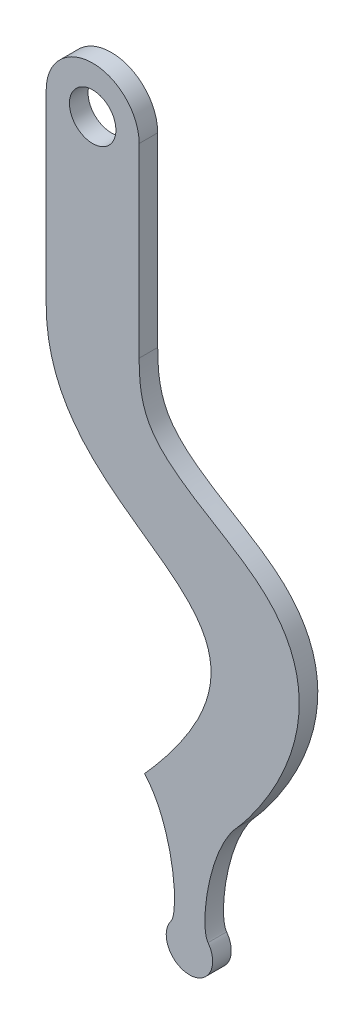
ISO-10303-21;
HEADER;
FILE_DESCRIPTION(('STEP AP214'),'2;1');
FILE_NAME('part.step','',(''),(''),'','','');
FILE_SCHEMA(('AUTOMOTIVE_DESIGN { 1 0 10303 214 1 1 1 1 }'));
ENDSEC;
DATA;
#1=APPLICATION_CONTEXT('core data for automotive mechanical design processes');
#2=APPLICATION_PROTOCOL_DEFINITION('international standard','automotive_design',2000,#1);
#3=PRODUCT_CONTEXT('',#1,'mechanical');
#4=PRODUCT('Part','Part','',(#3));
#5=PRODUCT_RELATED_PRODUCT_CATEGORY('part','',(#4));
#6=PRODUCT_DEFINITION_FORMATION('','',#4);
#7=PRODUCT_DEFINITION_CONTEXT('part definition',#1,'design');
#8=PRODUCT_DEFINITION('design','',#6,#7);
#9=PRODUCT_DEFINITION_SHAPE('','',#8);
#10=(LENGTH_UNIT() NAMED_UNIT(*) SI_UNIT(.MILLI.,.METRE.));
#11=(NAMED_UNIT(*) PLANE_ANGLE_UNIT() SI_UNIT($,.RADIAN.));
#12=(NAMED_UNIT(*) SI_UNIT($,.STERADIAN.) SOLID_ANGLE_UNIT());
#13=UNCERTAINTY_MEASURE_WITH_UNIT(LENGTH_MEASURE(1.E-05),#10,'distance_accuracy_value','');
#14=(GEOMETRIC_REPRESENTATION_CONTEXT(3) GLOBAL_UNCERTAINTY_ASSIGNED_CONTEXT((#13)) GLOBAL_UNIT_ASSIGNED_CONTEXT((#10,
#11,#12)) REPRESENTATION_CONTEXT('',''));
#15=CARTESIAN_POINT('',(0.,0.,0.));
#16=DIRECTION('',(0.,0.,1.));
#17=DIRECTION('',(1.,0.,0.));
#18=AXIS2_PLACEMENT_3D('',#15,#16,#17);
#19=CARTESIAN_POINT('',(0.696388497802958,-4.20667264142367,0.2));
#20=DIRECTION('',(0.,0.,-1.));
#21=DIRECTION('',(-1.,0.,0.));
#22=AXIS2_PLACEMENT_3D('',#19,#20,#21);
#23=PLANE('',#22);
#24=CARTESIAN_POINT('',(0.105412554621511,-6.10048055354415,0.199999999999999));
#25=CARTESIAN_POINT('',(0.148079668611347,-6.05492728087401,0.199999999999999));
#26=CARTESIAN_POINT('',(1.61155707372034,-4.39334483472324,0.2));
#27=CARTESIAN_POINT('',(-0.792723593902476,-3.03979449257337,0.2));
#28=CARTESIAN_POINT('',(-0.95304954466865,-2.7775961525932,0.2));
#29=CARTESIAN_POINT('',(-0.95304954466865,-2.25804121810582,0.2));
#30=B_SPLINE_CURVE_WITH_KNOTS('',3,(#24,#25,#26,#27,#28,#29),.UNSPECIFIED.,.F.,.F.,(4,1,1,4),
(0.,0.597240631349052,0.697240631349052,1.),.UNSPECIFIED.);
#31=CARTESIAN_POINT('',(0.105412554621511,-6.10048055354415,0.199999999999999));
#32=VERTEX_POINT('',#31);
#33=CARTESIAN_POINT('',(-0.95304954466865,-2.25804121810582,0.2));
#34=VERTEX_POINT('',#33);
#35=EDGE_CURVE('E174',#32,#34,#30,.T.);
#36=ORIENTED_EDGE('',*,*,#35,.T.);
#37=DIRECTION('',(0.,1.,0.));
#38=VECTOR('',#37,1.);
#39=CARTESIAN_POINT('',(-0.953049544668638,-0.258041218105816,0.199999999999999));
#40=LINE('',#39,#38);
#41=CARTESIAN_POINT('',(-0.953049544668638,-0.258041218105816,0.199999999999999));
#42=VERTEX_POINT('',#41);
#43=EDGE_CURVE('E95',#34,#42,#40,.T.);
#44=ORIENTED_EDGE('',*,*,#43,.T.);
#45=CARTESIAN_POINT('',(-1.45304954466864,-0.25804121810582,0.2));
#46=DIRECTION('',(0.,0.,1.));
#47=DIRECTION('',(1.,0.,0.));
#48=AXIS2_PLACEMENT_3D('',#45,#46,#47);
#49=CIRCLE('',#48,0.5);
#50=CARTESIAN_POINT('',(-1.95304954466864,-0.258041218105816,0.2));
#51=VERTEX_POINT('',#50);
#52=EDGE_CURVE('E172',#42,#51,#49,.T.);
#53=ORIENTED_EDGE('',*,*,#52,.T.);
#54=DIRECTION('',(0.,-1.,0.));
#55=VECTOR('',#54,1.);
#56=CARTESIAN_POINT('',(-1.95304954466864,-0.258041218105816,0.2));
#57=LINE('',#56,#55);
#58=CARTESIAN_POINT('',(-1.95304954466864,-2.25804121810582,0.2));
#59=VERTEX_POINT('',#58);
#60=EDGE_CURVE('E167',#51,#59,#57,.T.);
#61=ORIENTED_EDGE('',*,*,#60,.T.);
#62=CARTESIAN_POINT('',(-1.95304954466864,-2.25804121810582,0.2));
#63=CARTESIAN_POINT('',(-1.95304954466864,-4.32449796511163,0.199999999999999));
#64=CARTESIAN_POINT('',(1.19310973735531,-3.74201596097796,0.199999999999999));
#65=CARTESIAN_POINT('',(-0.894587445378502,-6.10048055354416,0.2));
#66=B_SPLINE_CURVE_WITH_KNOTS('',3,(#62,#63,#64,#65),.UNSPECIFIED.,.F.,.F.,(4,4),(0.,1.),.UNSPECIFIED.);
#67=CARTESIAN_POINT('',(-0.894587445378502,-6.10048055354416,0.2));
#68=VERTEX_POINT('',#67);
#69=EDGE_CURVE('E114',#59,#68,#66,.T.);
#70=ORIENTED_EDGE('',*,*,#69,.T.);
#71=CARTESIAN_POINT('',(-0.89458744537849,-6.10048055354415,0.2));
#72=CARTESIAN_POINT('',(-0.584931114540511,-6.43434475882679,0.2));
#73=CARTESIAN_POINT('',(-0.516679069850095,-7.20728168186501,0.2));
#74=CARTESIAN_POINT('',(-0.61167974459731,-7.33394924819462,0.199999999999999));
#75=B_SPLINE_CURVE_WITH_KNOTS('',3,(#71,#72,#73,#74),.UNSPECIFIED.,.F.,.F.,(4,4),(0.,1.),.UNSPECIFIED.);
#76=CARTESIAN_POINT('',(-0.61167974459731,-7.33394924819462,0.199999999999999));
#77=VERTEX_POINT('',#76);
#78=EDGE_CURVE('E108',#68,#77,#75,.T.);
#79=ORIENTED_EDGE('',*,*,#78,.T.);
#80=CARTESIAN_POINT('',(-0.411679744597299,-7.48394924819463,0.2));
#81=DIRECTION('',(0.,0.,1.));
#82=DIRECTION('',(1.,0.,0.));
#83=AXIS2_PLACEMENT_3D('',#80,#81,#82);
#84=CIRCLE('',#83,0.25);
#85=CARTESIAN_POINT('',(-0.21167974459731,-7.33394924819463,0.2));
#86=VERTEX_POINT('',#85);
#87=EDGE_CURVE('E112',#77,#86,#84,.T.);
#88=ORIENTED_EDGE('',*,*,#87,.T.);
#89=CARTESIAN_POINT('',(-0.21167974459731,-7.33394924819463,0.2));
#90=CARTESIAN_POINT('',(-0.302912234997973,-7.21230592766041,0.2));
#91=CARTESIAN_POINT('',(-0.211828565051513,-6.43918101568676,0.2));
#92=CARTESIAN_POINT('',(0.105412554621511,-6.10048055354415,0.199999999999999));
#93=B_SPLINE_CURVE_WITH_KNOTS('',3,(#89,#90,#91,#92),.UNSPECIFIED.,.F.,.F.,(4,4),(0.,1.),.UNSPECIFIED.);
#94=EDGE_CURVE('E52',#86,#32,#93,.T.);
#95=ORIENTED_EDGE('',*,*,#94,.T.);
#96=EDGE_LOOP('',(#36,#44,#53,#61,#70,#79,#88,#95));
#97=FACE_BOUND('',#96,.T.);
#98=CARTESIAN_POINT('',(-1.45304954466864,-0.25804121810582,0.2));
#99=DIRECTION('',(0.,0.,1.));
#100=DIRECTION('',(1.,0.,0.));
#101=AXIS2_PLACEMENT_3D('',#98,#99,#100);
#102=CIRCLE('',#101,0.25);
#103=CARTESIAN_POINT('',(-1.20304954466864,-0.25804121810582,0.2));
#104=VERTEX_POINT('',#103);
#105=EDGE_CURVE('E185',#104,#104,#102,.T.);
#106=ORIENTED_EDGE('',*,*,#105,.F.);
#107=EDGE_LOOP('',(#106));
#108=FACE_BOUND('',#107,.T.);
#109=ADVANCED_FACE('F34',(#97,#108),#23,.F.);
#110=CARTESIAN_POINT('',(0.696388497802958,-4.20667264142367,0.));
#111=DIRECTION('',(0.,0.,-1.));
#112=DIRECTION('',(-1.,0.,0.));
#113=AXIS2_PLACEMENT_3D('',#110,#111,#112);
#114=PLANE('',#113);
#115=CARTESIAN_POINT('',(0.105412554621511,-6.10048055354415,0.));
#116=CARTESIAN_POINT('',(0.148079668611347,-6.054927280874,0.));
#117=CARTESIAN_POINT('',(1.61155707372034,-4.39334483472324,0.));
#118=CARTESIAN_POINT('',(-0.792723593902476,-3.03979449257337,0.));
#119=CARTESIAN_POINT('',(-0.95304954466865,-2.7775961525932,0.));
#120=CARTESIAN_POINT('',(-0.95304954466865,-2.25804121810582,0.));
#121=B_SPLINE_CURVE_WITH_KNOTS('',3,(#115,#116,#117,#118,#119,#120),.UNSPECIFIED.,.F.,.F.,(4,1,
1,4),(0.,0.597240631349052,0.697240631349052,1.),.UNSPECIFIED.);
#122=CARTESIAN_POINT('',(0.105412554621511,-6.10048055354414,0.));
#123=VERTEX_POINT('',#122);
#124=CARTESIAN_POINT('',(-0.95304954466865,-2.25804121810582,0.));
#125=VERTEX_POINT('',#124);
#126=EDGE_CURVE('E138',#123,#125,#121,.T.);
#127=ORIENTED_EDGE('',*,*,#126,.F.);
#128=CARTESIAN_POINT('',(-0.21167974459731,-7.33394924819462,0.));
#129=CARTESIAN_POINT('',(-0.302912234997973,-7.21230592766041,0.));
#130=CARTESIAN_POINT('',(-0.211828565051513,-6.43918101568676,0.));
#131=CARTESIAN_POINT('',(0.105412554621511,-6.10048055354414,0.));
#132=B_SPLINE_CURVE_WITH_KNOTS('',3,(#128,#129,#130,#131),.UNSPECIFIED.,.F.,.F.,(4,4),(0.,1.),.UNSPECIFIED.);
#133=CARTESIAN_POINT('',(-0.21167974459731,-7.33394924819462,0.));
#134=VERTEX_POINT('',#133);
#135=EDGE_CURVE('E87',#134,#123,#132,.T.);
#136=ORIENTED_EDGE('',*,*,#135,.F.);
#137=CARTESIAN_POINT('',(-0.411679744597299,-7.48394924819463,0.));
#138=DIRECTION('',(0.,0.,1.));
#139=DIRECTION('',(1.,0.,0.));
#140=AXIS2_PLACEMENT_3D('',#137,#138,#139);
#141=CIRCLE('',#140,0.25);
#142=CARTESIAN_POINT('',(-0.61167974459731,-7.33394924819462,0.));
#143=VERTEX_POINT('',#142);
#144=EDGE_CURVE('E81',#143,#134,#141,.T.);
#145=ORIENTED_EDGE('',*,*,#144,.F.);
#146=CARTESIAN_POINT('',(-0.89458744537849,-6.10048055354415,0.));
#147=CARTESIAN_POINT('',(-0.584931114540511,-6.43434475882679,0.));
#148=CARTESIAN_POINT('',(-0.516679069850095,-7.207281681865,0.));
#149=CARTESIAN_POINT('',(-0.61167974459731,-7.33394924819462,0.));
#150=B_SPLINE_CURVE_WITH_KNOTS('',3,(#146,#147,#148,#149),.UNSPECIFIED.,.F.,.F.,(4,4),(0.,1.),.UNSPECIFIED.);
#151=CARTESIAN_POINT('',(-0.894587445378502,-6.10048055354416,0.));
#152=VERTEX_POINT('',#151);
#153=EDGE_CURVE('E122',#152,#143,#150,.T.);
#154=ORIENTED_EDGE('',*,*,#153,.F.);
#155=CARTESIAN_POINT('',(-1.95304954466864,-2.25804121810582,0.));
#156=CARTESIAN_POINT('',(-1.95304954466864,-4.32449796511163,0.));
#157=CARTESIAN_POINT('',(1.19310973735531,-3.74201596097796,0.));
#158=CARTESIAN_POINT('',(-0.894587445378502,-6.10048055354416,0.));
#159=B_SPLINE_CURVE_WITH_KNOTS('',3,(#155,#156,#157,#158),.UNSPECIFIED.,.F.,.F.,(4,4),(0.,1.),.UNSPECIFIED.);
#160=CARTESIAN_POINT('',(-1.95304954466864,-2.25804121810582,0.));
#161=VERTEX_POINT('',#160);
#162=EDGE_CURVE('E200',#161,#152,#159,.T.);
#163=ORIENTED_EDGE('',*,*,#162,.F.);
#164=DIRECTION('',(0.,-1.,0.));
#165=VECTOR('',#164,1.);
#166=CARTESIAN_POINT('',(-1.95304954466864,-0.258041218105816,0.));
#167=LINE('',#166,#165);
#168=CARTESIAN_POINT('',(-1.95304954466864,-0.258041218105816,0.));
#169=VERTEX_POINT('',#168);
#170=EDGE_CURVE('E196',#169,#161,#167,.T.);
#171=ORIENTED_EDGE('',*,*,#170,.F.);
#172=CARTESIAN_POINT('',(-1.45304954466864,-0.25804121810582,0.));
#173=DIRECTION('',(0.,0.,1.));
#174=DIRECTION('',(1.,0.,0.));
#175=AXIS2_PLACEMENT_3D('',#172,#173,#174);
#176=CIRCLE('',#175,0.5);
#177=CARTESIAN_POINT('',(-0.953049544668638,-0.258041218105816,0.));
#178=VERTEX_POINT('',#177);
#179=EDGE_CURVE('E194',#178,#169,#176,.T.);
#180=ORIENTED_EDGE('',*,*,#179,.F.);
#181=DIRECTION('',(0.,1.,0.));
#182=VECTOR('',#181,1.);
#183=CARTESIAN_POINT('',(-0.953049544668638,-0.258041218105816,0.));
#184=LINE('',#183,#182);
#185=EDGE_CURVE('E190',#125,#178,#184,.T.);
#186=ORIENTED_EDGE('',*,*,#185,.F.);
#187=EDGE_LOOP('',(#127,#136,#145,#154,#163,#171,#180,#186));
#188=FACE_BOUND('',#187,.T.);
#189=CARTESIAN_POINT('',(-1.45304954466864,-0.25804121810582,0.));
#190=DIRECTION('',(0.,0.,1.));
#191=DIRECTION('',(1.,0.,0.));
#192=AXIS2_PLACEMENT_3D('',#189,#190,#191);
#193=CIRCLE('',#192,0.25);
#194=CARTESIAN_POINT('',(-1.20304954466864,-0.25804121810582,0.));
#195=VERTEX_POINT('',#194);
#196=EDGE_CURVE('E179',#195,#195,#193,.T.);
#197=ORIENTED_EDGE('',*,*,#196,.T.);
#198=EDGE_LOOP('',(#197));
#199=FACE_BOUND('',#198,.T.);
#200=ADVANCED_FACE('F151',(#188,#199),#114,.T.);
#201=DIRECTION('',(0.,0.,-1.));
#202=VECTOR('',#201,1.);
#203=SURFACE_OF_LINEAR_EXTRUSION('',#30,#202);
#204=ORIENTED_EDGE('',*,*,#126,.T.);
#205=DIRECTION('',(0.,0.,-1.));
#206=VECTOR('',#205,1.);
#207=CARTESIAN_POINT('',(-0.95304954466865,-2.25804121810582,0.2));
#208=LINE('',#207,#206);
#209=EDGE_CURVE('E11',#34,#125,#208,.T.);
#210=ORIENTED_EDGE('',*,*,#209,.F.);
#211=ORIENTED_EDGE('',*,*,#35,.F.);
#212=DIRECTION('',(0.,0.,-1.));
#213=VECTOR('',#212,1.);
#214=CARTESIAN_POINT('',(0.105412554621511,-6.10048055354415,0.199999999999999));
#215=LINE('',#214,#213);
#216=EDGE_CURVE('E128',#32,#123,#215,.T.);
#217=ORIENTED_EDGE('',*,*,#216,.T.);
#218=EDGE_LOOP('',(#204,#210,#211,#217));
#219=FACE_BOUND('',#218,.T.);
#220=ADVANCED_FACE('F36',(#219),#203,.F.);
#221=CARTESIAN_POINT('',(-0.953049544668638,-0.258041218105816,0.199999999999999));
#222=DIRECTION('',(-1.,0.,0.));
#223=DIRECTION('',(0.,-1.,0.));
#224=AXIS2_PLACEMENT_3D('',#221,#222,#223);
#225=PLANE('',#224);
#226=ORIENTED_EDGE('',*,*,#185,.T.);
#227=DIRECTION('',(0.,0.,-1.));
#228=VECTOR('',#227,1.);
#229=CARTESIAN_POINT('',(-0.953049544668638,-0.258041218105816,0.199999999999999));
#230=LINE('',#229,#228);
#231=EDGE_CURVE('E44',#42,#178,#230,.T.);
#232=ORIENTED_EDGE('',*,*,#231,.F.);
#233=ORIENTED_EDGE('',*,*,#43,.F.);
#234=ORIENTED_EDGE('',*,*,#209,.T.);
#235=EDGE_LOOP('',(#226,#232,#233,#234));
#236=FACE_BOUND('',#235,.T.);
#237=ADVANCED_FACE('F241',(#236),#225,.F.);
#238=CARTESIAN_POINT('',(-1.45304954466864,-0.25804121810582,0.2));
#239=DIRECTION('',(0.,0.,-1.));
#240=DIRECTION('',(-1.,0.,0.));
#241=AXIS2_PLACEMENT_3D('',#238,#239,#240);
#242=CYLINDRICAL_SURFACE('',#241,0.5);
#243=ORIENTED_EDGE('',*,*,#179,.T.);
#244=DIRECTION('',(0.,0.,-1.));
#245=VECTOR('',#244,1.);
#246=CARTESIAN_POINT('',(-1.95304954466864,-0.258041218105816,0.2));
#247=LINE('',#246,#245);
#248=EDGE_CURVE('E226',#51,#169,#247,.T.);
#249=ORIENTED_EDGE('',*,*,#248,.F.);
#250=ORIENTED_EDGE('',*,*,#52,.F.);
#251=ORIENTED_EDGE('',*,*,#231,.T.);
#252=EDGE_LOOP('',(#243,#249,#250,#251));
#253=FACE_BOUND('',#252,.T.);
#254=ADVANCED_FACE('F231',(#253),#242,.T.);
#255=CARTESIAN_POINT('',(-1.95304954466864,-0.258041218105816,0.2));
#256=DIRECTION('',(1.,0.,0.));
#257=DIRECTION('',(0.,1.,0.));
#258=AXIS2_PLACEMENT_3D('',#255,#256,#257);
#259=PLANE('',#258);
#260=ORIENTED_EDGE('',*,*,#170,.T.);
#261=DIRECTION('',(0.,0.,-1.));
#262=VECTOR('',#261,1.);
#263=CARTESIAN_POINT('',(-1.95304954466864,-2.25804121810582,0.2));
#264=LINE('',#263,#262);
#265=EDGE_CURVE('E223',#59,#161,#264,.T.);
#266=ORIENTED_EDGE('',*,*,#265,.F.);
#267=ORIENTED_EDGE('',*,*,#60,.F.);
#268=ORIENTED_EDGE('',*,*,#248,.T.);
#269=EDGE_LOOP('',(#260,#266,#267,#268));
#270=FACE_BOUND('',#269,.T.);
#271=ADVANCED_FACE('F160',(#270),#259,.F.);
#272=DIRECTION('',(0.,0.,-1.));
#273=VECTOR('',#272,1.);
#274=SURFACE_OF_LINEAR_EXTRUSION('',#66,#273);
#275=ORIENTED_EDGE('',*,*,#162,.T.);
#276=DIRECTION('',(0.,0.,-1.));
#277=VECTOR('',#276,1.);
#278=CARTESIAN_POINT('',(-0.894587445378502,-6.10048055354416,0.2));
#279=LINE('',#278,#277);
#280=EDGE_CURVE('E123',#68,#152,#279,.T.);
#281=ORIENTED_EDGE('',*,*,#280,.F.);
#282=ORIENTED_EDGE('',*,*,#69,.F.);
#283=ORIENTED_EDGE('',*,*,#265,.T.);
#284=EDGE_LOOP('',(#275,#281,#282,#283));
#285=FACE_BOUND('',#284,.T.);
#286=ADVANCED_FACE('F157',(#285),#274,.F.);
#287=DIRECTION('',(0.,0.,-1.));
#288=VECTOR('',#287,1.);
#289=SURFACE_OF_LINEAR_EXTRUSION('',#75,#288);
#290=ORIENTED_EDGE('',*,*,#153,.T.);
#291=DIRECTION('',(0.,0.,-1.));
#292=VECTOR('',#291,1.);
#293=CARTESIAN_POINT('',(-0.61167974459731,-7.33394924819462,0.199999999999999));
#294=LINE('',#293,#292);
#295=EDGE_CURVE('E119',#77,#143,#294,.T.);
#296=ORIENTED_EDGE('',*,*,#295,.F.);
#297=ORIENTED_EDGE('',*,*,#78,.F.);
#298=ORIENTED_EDGE('',*,*,#280,.T.);
#299=EDGE_LOOP('',(#290,#296,#297,#298));
#300=FACE_BOUND('',#299,.T.);
#301=ADVANCED_FACE('F120',(#300),#289,.F.);
#302=CARTESIAN_POINT('',(-0.411679744597299,-7.48394924819463,0.2));
#303=DIRECTION('',(0.,0.,-1.));
#304=DIRECTION('',(-1.,0.,0.));
#305=AXIS2_PLACEMENT_3D('',#302,#303,#304);
#306=CYLINDRICAL_SURFACE('',#305,0.25);
#307=ORIENTED_EDGE('',*,*,#144,.T.);
#308=DIRECTION('',(0.,0.,-1.));
#309=VECTOR('',#308,1.);
#310=CARTESIAN_POINT('',(-0.21167974459731,-7.33394924819463,0.2));
#311=LINE('',#310,#309);
#312=EDGE_CURVE('E124',#86,#134,#311,.T.);
#313=ORIENTED_EDGE('',*,*,#312,.F.);
#314=ORIENTED_EDGE('',*,*,#87,.F.);
#315=ORIENTED_EDGE('',*,*,#295,.T.);
#316=EDGE_LOOP('',(#307,#313,#314,#315));
#317=FACE_BOUND('',#316,.T.);
#318=ADVANCED_FACE('F126',(#317),#306,.T.);
#319=DIRECTION('',(0.,0.,-1.));
#320=VECTOR('',#319,1.);
#321=SURFACE_OF_LINEAR_EXTRUSION('',#93,#320);
#322=ORIENTED_EDGE('',*,*,#135,.T.);
#323=ORIENTED_EDGE('',*,*,#216,.F.);
#324=ORIENTED_EDGE('',*,*,#94,.F.);
#325=ORIENTED_EDGE('',*,*,#312,.T.);
#326=EDGE_LOOP('',(#322,#323,#324,#325));
#327=FACE_BOUND('',#326,.T.);
#328=ADVANCED_FACE('F146',(#327),#321,.F.);
#329=CARTESIAN_POINT('',(-1.45304954466864,-0.25804121810582,0.2));
#330=DIRECTION('',(0.,0.,-1.));
#331=DIRECTION('',(-1.,0.,0.));
#332=AXIS2_PLACEMENT_3D('',#329,#330,#331);
#333=CYLINDRICAL_SURFACE('',#332,0.25);
#334=ORIENTED_EDGE('',*,*,#105,.T.);
#335=EDGE_LOOP('',(#334));
#336=FACE_BOUND('',#335,.T.);
#337=ORIENTED_EDGE('',*,*,#196,.F.);
#338=EDGE_LOOP('',(#337));
#339=FACE_BOUND('',#338,.T.);
#340=ADVANCED_FACE('F150',(#336,#339),#333,.F.);
#341=CLOSED_SHELL('',(#109,#200,#220,#237,#254,#271,#286,#301,#318,#328,#340));
#342=MANIFOLD_SOLID_BREP('B2',#341);
#343=ADVANCED_BREP_SHAPE_REPRESENTATION('',(#18,#342),#14);
#344=SHAPE_DEFINITION_REPRESENTATION(#9,#343);
ENDSEC;
END-ISO-10303-21;
